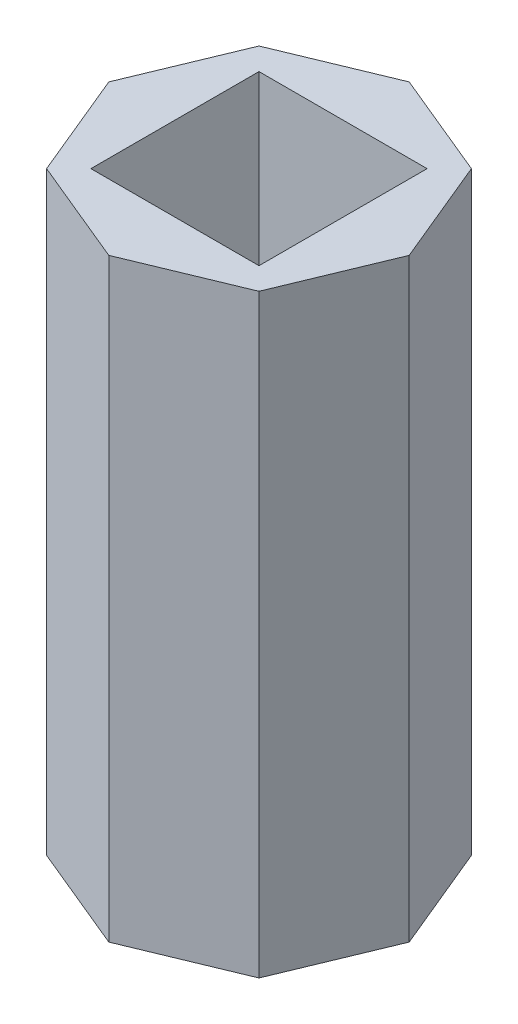
ISO-10303-21;
HEADER;
FILE_DESCRIPTION(('STEP AP214'),'2;1');
FILE_NAME('part.step','',(''),(''),'','','');
FILE_SCHEMA(('AUTOMOTIVE_DESIGN { 1 0 10303 214 1 1 1 1 }'));
ENDSEC;
DATA;
#1=APPLICATION_CONTEXT('core data for automotive mechanical design processes');
#2=APPLICATION_PROTOCOL_DEFINITION('international standard','automotive_design',2000,#1);
#3=PRODUCT_CONTEXT('',#1,'mechanical');
#4=PRODUCT('Part','Part','',(#3));
#5=PRODUCT_RELATED_PRODUCT_CATEGORY('part','',(#4));
#6=PRODUCT_DEFINITION_FORMATION('','',#4);
#7=PRODUCT_DEFINITION_CONTEXT('part definition',#1,'design');
#8=PRODUCT_DEFINITION('design','',#6,#7);
#9=PRODUCT_DEFINITION_SHAPE('','',#8);
#10=(LENGTH_UNIT() NAMED_UNIT(*) SI_UNIT(.MILLI.,.METRE.));
#11=(NAMED_UNIT(*) PLANE_ANGLE_UNIT() SI_UNIT($,.RADIAN.));
#12=(NAMED_UNIT(*) SI_UNIT($,.STERADIAN.) SOLID_ANGLE_UNIT());
#13=UNCERTAINTY_MEASURE_WITH_UNIT(LENGTH_MEASURE(1.E-05),#10,'distance_accuracy_value','');
#14=(GEOMETRIC_REPRESENTATION_CONTEXT(3) GLOBAL_UNCERTAINTY_ASSIGNED_CONTEXT((#13)) GLOBAL_UNIT_ASSIGNED_CONTEXT((#10,
#11,#12)) REPRESENTATION_CONTEXT('',''));
#15=CARTESIAN_POINT('',(0.,0.,0.));
#16=DIRECTION('',(0.,0.,1.));
#17=DIRECTION('',(1.,0.,0.));
#18=AXIS2_PLACEMENT_3D('',#15,#16,#17);
#19=CARTESIAN_POINT('',(0.,11.90625,0.));
#20=DIRECTION('',(0.,1.,0.));
#21=DIRECTION('',(0.,0.,1.));
#22=AXIS2_PLACEMENT_3D('',#19,#20,#21);
#23=PLANE('',#22);
#24=DIRECTION('',(-0.92387953251129,0.,-0.382683432365082));
#25=VECTOR('',#24,1.);
#26=CARTESIAN_POINT('',(4.25256964215703,11.90625,-4.2525696421571));
#27=LINE('',#26,#25);
#28=CARTESIAN_POINT('',(4.25256964215703,11.90625,-4.2525696421571));
#29=VERTEX_POINT('',#28);
#30=CARTESIAN_POINT('',(0.,11.90625,-6.01404166287462));
#31=VERTEX_POINT('',#30);
#32=EDGE_CURVE('E164',#29,#31,#27,.T.);
#33=ORIENTED_EDGE('',*,*,#32,.T.);
#34=DIRECTION('',(-0.923879532511283,0.,0.382683432365098));
#35=VECTOR('',#34,1.);
#36=CARTESIAN_POINT('',(0.,11.90625,-6.01404166287462));
#37=LINE('',#36,#35);
#38=CARTESIAN_POINT('',(-4.2525696421571,11.90625,-4.25256964215702));
#39=VERTEX_POINT('',#38);
#40=EDGE_CURVE('E167',#31,#39,#37,.T.);
#41=ORIENTED_EDGE('',*,*,#40,.T.);
#42=DIRECTION('',(-0.382683432365082,0.,0.92387953251129));
#43=VECTOR('',#42,1.);
#44=CARTESIAN_POINT('',(-4.2525696421571,11.90625,-4.25256964215702));
#45=LINE('',#44,#43);
#46=CARTESIAN_POINT('',(-6.01404166287461,11.90625,0.));
#47=VERTEX_POINT('',#46);
#48=EDGE_CURVE('E170',#39,#47,#45,.T.);
#49=ORIENTED_EDGE('',*,*,#48,.T.);
#50=DIRECTION('',(0.382683432365098,0.,0.923879532511283));
#51=VECTOR('',#50,1.);
#52=CARTESIAN_POINT('',(-6.01404166287461,11.90625,0.));
#53=LINE('',#52,#51);
#54=CARTESIAN_POINT('',(-4.25256964215702,11.90625,4.2525696421571));
#55=VERTEX_POINT('',#54);
#56=EDGE_CURVE('E172',#47,#55,#53,.T.);
#57=ORIENTED_EDGE('',*,*,#56,.T.);
#58=DIRECTION('',(0.92387953251129,0.,0.382683432365082));
#59=VECTOR('',#58,1.);
#60=CARTESIAN_POINT('',(-4.25256964215702,11.90625,4.2525696421571));
#61=LINE('',#60,#59);
#62=CARTESIAN_POINT('',(0.,11.90625,6.01404166287461));
#63=VERTEX_POINT('',#62);
#64=EDGE_CURVE('E174',#55,#63,#61,.T.);
#65=ORIENTED_EDGE('',*,*,#64,.T.);
#66=DIRECTION('',(0.923879532511284,0.,-0.382683432365097));
#67=VECTOR('',#66,1.);
#68=CARTESIAN_POINT('',(0.,11.90625,6.01404166287461));
#69=LINE('',#68,#67);
#70=CARTESIAN_POINT('',(4.2525696421571,11.90625,4.25256964215703));
#71=VERTEX_POINT('',#70);
#72=EDGE_CURVE('E176',#63,#71,#69,.T.);
#73=ORIENTED_EDGE('',*,*,#72,.T.);
#74=DIRECTION('',(0.382683432365082,0.,-0.92387953251129));
#75=VECTOR('',#74,1.);
#76=CARTESIAN_POINT('',(4.2525696421571,11.90625,4.25256964215703));
#77=LINE('',#76,#75);
#78=CARTESIAN_POINT('',(6.01404166287462,11.90625,0.));
#79=VERTEX_POINT('',#78);
#80=EDGE_CURVE('E178',#71,#79,#77,.T.);
#81=ORIENTED_EDGE('',*,*,#80,.T.);
#82=DIRECTION('',(-0.382683432365098,0.,-0.923879532511283));
#83=VECTOR('',#82,1.);
#84=CARTESIAN_POINT('',(6.01404166287462,11.90625,0.));
#85=LINE('',#84,#83);
#86=EDGE_CURVE('E180',#79,#29,#85,.T.);
#87=ORIENTED_EDGE('',*,*,#86,.T.);
#88=EDGE_LOOP('',(#33,#41,#49,#57,#65,#73,#81,#87));
#89=FACE_BOUND('',#88,.T.);
#90=DIRECTION('',(-1.,0.,0.));
#91=VECTOR('',#90,1.);
#92=CARTESIAN_POINT('',(-3.3655,11.90625,-3.3655));
#93=LINE('',#92,#91);
#94=CARTESIAN_POINT('',(3.3655,11.90625,-3.3655));
#95=VERTEX_POINT('',#94);
#96=CARTESIAN_POINT('',(-3.3655,11.90625,-3.3655));
#97=VERTEX_POINT('',#96);
#98=EDGE_CURVE('E136',#95,#97,#93,.T.);
#99=ORIENTED_EDGE('',*,*,#98,.F.);
#100=DIRECTION('',(0.,0.,-1.));
#101=VECTOR('',#100,1.);
#102=CARTESIAN_POINT('',(3.3655,11.90625,3.3655));
#103=LINE('',#102,#101);
#104=CARTESIAN_POINT('',(3.3655,11.90625,3.3655));
#105=VERTEX_POINT('',#104);
#106=EDGE_CURVE('E128',#105,#95,#103,.T.);
#107=ORIENTED_EDGE('',*,*,#106,.F.);
#108=DIRECTION('',(1.,0.,0.));
#109=VECTOR('',#108,1.);
#110=CARTESIAN_POINT('',(-3.3655,11.90625,3.3655));
#111=LINE('',#110,#109);
#112=CARTESIAN_POINT('',(-3.3655,11.90625,3.3655));
#113=VERTEX_POINT('',#112);
#114=EDGE_CURVE('E150',#113,#105,#111,.T.);
#115=ORIENTED_EDGE('',*,*,#114,.F.);
#116=DIRECTION('',(0.,0.,1.));
#117=VECTOR('',#116,1.);
#118=CARTESIAN_POINT('',(-3.3655,11.90625,3.3655));
#119=LINE('',#118,#117);
#120=EDGE_CURVE('E148',#97,#113,#119,.T.);
#121=ORIENTED_EDGE('',*,*,#120,.F.);
#122=EDGE_LOOP('',(#99,#107,#115,#121));
#123=FACE_BOUND('',#122,.T.);
#124=ADVANCED_FACE('F39',(#89,#123),#23,.T.);
#125=CARTESIAN_POINT('',(0.,-11.90625,0.));
#126=DIRECTION('',(0.,1.,0.));
#127=DIRECTION('',(0.,0.,1.));
#128=AXIS2_PLACEMENT_3D('',#125,#126,#127);
#129=PLANE('',#128);
#130=DIRECTION('',(-0.92387953251129,0.,-0.382683432365082));
#131=VECTOR('',#130,1.);
#132=CARTESIAN_POINT('',(4.25256964215703,-11.90625,-4.2525696421571));
#133=LINE('',#132,#131);
#134=CARTESIAN_POINT('',(4.25256964215703,-11.90625,-4.2525696421571));
#135=VERTEX_POINT('',#134);
#136=CARTESIAN_POINT('',(0.,-11.90625,-6.01404166287462));
#137=VERTEX_POINT('',#136);
#138=EDGE_CURVE('E144',#135,#137,#133,.T.);
#139=ORIENTED_EDGE('',*,*,#138,.F.);
#140=DIRECTION('',(-0.382683432365098,0.,-0.923879532511283));
#141=VECTOR('',#140,1.);
#142=CARTESIAN_POINT('',(6.01404166287462,-11.90625,0.));
#143=LINE('',#142,#141);
#144=CARTESIAN_POINT('',(6.01404166287462,-11.90625,0.));
#145=VERTEX_POINT('',#144);
#146=EDGE_CURVE('E168',#145,#135,#143,.T.);
#147=ORIENTED_EDGE('',*,*,#146,.F.);
#148=DIRECTION('',(0.382683432365082,0.,-0.92387953251129));
#149=VECTOR('',#148,1.);
#150=CARTESIAN_POINT('',(4.2525696421571,-11.90625,4.25256964215703));
#151=LINE('',#150,#149);
#152=CARTESIAN_POINT('',(4.2525696421571,-11.90625,4.25256964215703));
#153=VERTEX_POINT('',#152);
#154=EDGE_CURVE('E195',#153,#145,#151,.T.);
#155=ORIENTED_EDGE('',*,*,#154,.F.);
#156=DIRECTION('',(0.923879532511284,0.,-0.382683432365097));
#157=VECTOR('',#156,1.);
#158=CARTESIAN_POINT('',(0.,-11.90625,6.01404166287461));
#159=LINE('',#158,#157);
#160=CARTESIAN_POINT('',(0.,-11.90625,6.01404166287461));
#161=VERTEX_POINT('',#160);
#162=EDGE_CURVE('E193',#161,#153,#159,.T.);
#163=ORIENTED_EDGE('',*,*,#162,.F.);
#164=DIRECTION('',(0.92387953251129,0.,0.382683432365082));
#165=VECTOR('',#164,1.);
#166=CARTESIAN_POINT('',(-4.25256964215702,-11.90625,4.2525696421571));
#167=LINE('',#166,#165);
#168=CARTESIAN_POINT('',(-4.25256964215702,-11.90625,4.2525696421571));
#169=VERTEX_POINT('',#168);
#170=EDGE_CURVE('E191',#169,#161,#167,.T.);
#171=ORIENTED_EDGE('',*,*,#170,.F.);
#172=DIRECTION('',(0.382683432365098,0.,0.923879532511283));
#173=VECTOR('',#172,1.);
#174=CARTESIAN_POINT('',(-6.01404166287461,-11.90625,0.));
#175=LINE('',#174,#173);
#176=CARTESIAN_POINT('',(-6.01404166287461,-11.90625,0.));
#177=VERTEX_POINT('',#176);
#178=EDGE_CURVE('E189',#177,#169,#175,.T.);
#179=ORIENTED_EDGE('',*,*,#178,.F.);
#180=DIRECTION('',(-0.382683432365082,0.,0.92387953251129));
#181=VECTOR('',#180,1.);
#182=CARTESIAN_POINT('',(-4.2525696421571,-11.90625,-4.25256964215702));
#183=LINE('',#182,#181);
#184=CARTESIAN_POINT('',(-4.2525696421571,-11.90625,-4.25256964215702));
#185=VERTEX_POINT('',#184);
#186=EDGE_CURVE('E187',#185,#177,#183,.T.);
#187=ORIENTED_EDGE('',*,*,#186,.F.);
#188=DIRECTION('',(-0.923879532511283,0.,0.382683432365098));
#189=VECTOR('',#188,1.);
#190=CARTESIAN_POINT('',(0.,-11.90625,-6.01404166287462));
#191=LINE('',#190,#189);
#192=EDGE_CURVE('E185',#137,#185,#191,.T.);
#193=ORIENTED_EDGE('',*,*,#192,.F.);
#194=EDGE_LOOP('',(#139,#147,#155,#163,#171,#179,#187,#193));
#195=FACE_BOUND('',#194,.T.);
#196=DIRECTION('',(0.,0.,-1.));
#197=VECTOR('',#196,1.);
#198=CARTESIAN_POINT('',(3.3655,-11.90625,3.3655));
#199=LINE('',#198,#197);
#200=CARTESIAN_POINT('',(3.3655,-11.90625,3.3655));
#201=VERTEX_POINT('',#200);
#202=CARTESIAN_POINT('',(3.3655,-11.90625,-3.3655));
#203=VERTEX_POINT('',#202);
#204=EDGE_CURVE('E62',#201,#203,#199,.T.);
#205=ORIENTED_EDGE('',*,*,#204,.T.);
#206=DIRECTION('',(-1.,0.,0.));
#207=VECTOR('',#206,1.);
#208=CARTESIAN_POINT('',(-3.3655,-11.90625,-3.3655));
#209=LINE('',#208,#207);
#210=CARTESIAN_POINT('',(-3.3655,-11.90625,-3.3655));
#211=VERTEX_POINT('',#210);
#212=EDGE_CURVE('E143',#203,#211,#209,.T.);
#213=ORIENTED_EDGE('',*,*,#212,.T.);
#214=DIRECTION('',(0.,0.,1.));
#215=VECTOR('',#214,1.);
#216=CARTESIAN_POINT('',(-3.3655,-11.90625,3.3655));
#217=LINE('',#216,#215);
#218=CARTESIAN_POINT('',(-3.3655,-11.90625,3.3655));
#219=VERTEX_POINT('',#218);
#220=EDGE_CURVE('E156',#211,#219,#217,.T.);
#221=ORIENTED_EDGE('',*,*,#220,.T.);
#222=DIRECTION('',(1.,0.,0.));
#223=VECTOR('',#222,1.);
#224=CARTESIAN_POINT('',(-3.3655,-11.90625,3.3655));
#225=LINE('',#224,#223);
#226=EDGE_CURVE('E137',#219,#201,#225,.T.);
#227=ORIENTED_EDGE('',*,*,#226,.T.);
#228=EDGE_LOOP('',(#205,#213,#221,#227));
#229=FACE_BOUND('',#228,.T.);
#230=ADVANCED_FACE('F225',(#195,#229),#129,.F.);
#231=CARTESIAN_POINT('',(4.25256964215703,11.90625,-4.2525696421571));
#232=DIRECTION('',(-0.382683432365082,0.,0.92387953251129));
#233=DIRECTION('',(0.92387953251129,0.,0.382683432365082));
#234=AXIS2_PLACEMENT_3D('',#231,#232,#233);
#235=PLANE('',#234);
#236=ORIENTED_EDGE('',*,*,#138,.T.);
#237=DIRECTION('',(0.,-1.,0.));
#238=VECTOR('',#237,1.);
#239=CARTESIAN_POINT('',(0.,11.90625,-6.01404166287462));
#240=LINE('',#239,#238);
#241=EDGE_CURVE('E11',#31,#137,#240,.T.);
#242=ORIENTED_EDGE('',*,*,#241,.F.);
#243=ORIENTED_EDGE('',*,*,#32,.F.);
#244=DIRECTION('',(0.,-1.,0.));
#245=VECTOR('',#244,1.);
#246=CARTESIAN_POINT('',(4.25256964215703,11.90625,-4.2525696421571));
#247=LINE('',#246,#245);
#248=EDGE_CURVE('E182',#29,#135,#247,.T.);
#249=ORIENTED_EDGE('',*,*,#248,.T.);
#250=EDGE_LOOP('',(#236,#242,#243,#249));
#251=FACE_BOUND('',#250,.T.);
#252=ADVANCED_FACE('F41',(#251),#235,.F.);
#253=CARTESIAN_POINT('',(0.,11.90625,-6.01404166287462));
#254=DIRECTION('',(0.382683432365098,0.,0.923879532511283));
#255=DIRECTION('',(0.923879532511283,0.,-0.382683432365098));
#256=AXIS2_PLACEMENT_3D('',#253,#254,#255);
#257=PLANE('',#256);
#258=ORIENTED_EDGE('',*,*,#192,.T.);
#259=DIRECTION('',(0.,-1.,0.));
#260=VECTOR('',#259,1.);
#261=CARTESIAN_POINT('',(-4.2525696421571,11.90625,-4.25256964215702));
#262=LINE('',#261,#260);
#263=EDGE_CURVE('E47',#39,#185,#262,.T.);
#264=ORIENTED_EDGE('',*,*,#263,.F.);
#265=ORIENTED_EDGE('',*,*,#40,.F.);
#266=ORIENTED_EDGE('',*,*,#241,.T.);
#267=EDGE_LOOP('',(#258,#264,#265,#266));
#268=FACE_BOUND('',#267,.T.);
#269=ADVANCED_FACE('F242',(#268),#257,.F.);
#270=CARTESIAN_POINT('',(-4.2525696421571,11.90625,-4.25256964215702));
#271=DIRECTION('',(0.92387953251129,0.,0.382683432365082));
#272=DIRECTION('',(0.382683432365082,0.,-0.92387953251129));
#273=AXIS2_PLACEMENT_3D('',#270,#271,#272);
#274=PLANE('',#273);
#275=ORIENTED_EDGE('',*,*,#186,.T.);
#276=DIRECTION('',(0.,-1.,0.));
#277=VECTOR('',#276,1.);
#278=CARTESIAN_POINT('',(-6.01404166287461,11.90625,0.));
#279=LINE('',#278,#277);
#280=EDGE_CURVE('E212',#47,#177,#279,.T.);
#281=ORIENTED_EDGE('',*,*,#280,.F.);
#282=ORIENTED_EDGE('',*,*,#48,.F.);
#283=ORIENTED_EDGE('',*,*,#263,.T.);
#284=EDGE_LOOP('',(#275,#281,#282,#283));
#285=FACE_BOUND('',#284,.T.);
#286=ADVANCED_FACE('F219',(#285),#274,.F.);
#287=CARTESIAN_POINT('',(-6.01404166287461,11.90625,0.));
#288=DIRECTION('',(0.923879532511283,0.,-0.382683432365098));
#289=DIRECTION('',(-0.382683432365098,0.,-0.923879532511283));
#290=AXIS2_PLACEMENT_3D('',#287,#288,#289);
#291=PLANE('',#290);
#292=ORIENTED_EDGE('',*,*,#178,.T.);
#293=DIRECTION('',(0.,-1.,0.));
#294=VECTOR('',#293,1.);
#295=CARTESIAN_POINT('',(-4.25256964215702,11.90625,4.2525696421571));
#296=LINE('',#295,#294);
#297=EDGE_CURVE('E209',#55,#169,#296,.T.);
#298=ORIENTED_EDGE('',*,*,#297,.F.);
#299=ORIENTED_EDGE('',*,*,#56,.F.);
#300=ORIENTED_EDGE('',*,*,#280,.T.);
#301=EDGE_LOOP('',(#292,#298,#299,#300));
#302=FACE_BOUND('',#301,.T.);
#303=ADVANCED_FACE('F231',(#302),#291,.F.);
#304=CARTESIAN_POINT('',(-4.25256964215702,11.90625,4.2525696421571));
#305=DIRECTION('',(0.382683432365082,0.,-0.92387953251129));
#306=DIRECTION('',(-0.92387953251129,0.,-0.382683432365082));
#307=AXIS2_PLACEMENT_3D('',#304,#305,#306);
#308=PLANE('',#307);
#309=ORIENTED_EDGE('',*,*,#170,.T.);
#310=DIRECTION('',(0.,-1.,0.));
#311=VECTOR('',#310,1.);
#312=CARTESIAN_POINT('',(0.,11.90625,6.01404166287461));
#313=LINE('',#312,#311);
#314=EDGE_CURVE('E206',#63,#161,#313,.T.);
#315=ORIENTED_EDGE('',*,*,#314,.F.);
#316=ORIENTED_EDGE('',*,*,#64,.F.);
#317=ORIENTED_EDGE('',*,*,#297,.T.);
#318=EDGE_LOOP('',(#309,#315,#316,#317));
#319=FACE_BOUND('',#318,.T.);
#320=ADVANCED_FACE('F235',(#319),#308,.F.);
#321=CARTESIAN_POINT('',(0.,11.90625,6.01404166287461));
#322=DIRECTION('',(-0.382683432365097,0.,-0.923879532511284));
#323=DIRECTION('',(-0.923879532511284,0.,0.382683432365097));
#324=AXIS2_PLACEMENT_3D('',#321,#322,#323);
#325=PLANE('',#324);
#326=ORIENTED_EDGE('',*,*,#162,.T.);
#327=DIRECTION('',(0.,-1.,0.));
#328=VECTOR('',#327,1.);
#329=CARTESIAN_POINT('',(4.2525696421571,11.90625,4.25256964215703));
#330=LINE('',#329,#328);
#331=EDGE_CURVE('E203',#71,#153,#330,.T.);
#332=ORIENTED_EDGE('',*,*,#331,.F.);
#333=ORIENTED_EDGE('',*,*,#72,.F.);
#334=ORIENTED_EDGE('',*,*,#314,.T.);
#335=EDGE_LOOP('',(#326,#332,#333,#334));
#336=FACE_BOUND('',#335,.T.);
#337=ADVANCED_FACE('F255',(#336),#325,.F.);
#338=CARTESIAN_POINT('',(4.2525696421571,11.90625,4.25256964215703));
#339=DIRECTION('',(-0.92387953251129,0.,-0.382683432365082));
#340=DIRECTION('',(-0.382683432365082,0.,0.92387953251129));
#341=AXIS2_PLACEMENT_3D('',#338,#339,#340);
#342=PLANE('',#341);
#343=ORIENTED_EDGE('',*,*,#154,.T.);
#344=DIRECTION('',(0.,-1.,0.));
#345=VECTOR('',#344,1.);
#346=CARTESIAN_POINT('',(6.01404166287462,11.90625,0.));
#347=LINE('',#346,#345);
#348=EDGE_CURVE('E200',#79,#145,#347,.T.);
#349=ORIENTED_EDGE('',*,*,#348,.F.);
#350=ORIENTED_EDGE('',*,*,#80,.F.);
#351=ORIENTED_EDGE('',*,*,#331,.T.);
#352=EDGE_LOOP('',(#343,#349,#350,#351));
#353=FACE_BOUND('',#352,.T.);
#354=ADVANCED_FACE('F253',(#353),#342,.F.);
#355=CARTESIAN_POINT('',(6.01404166287462,11.90625,0.));
#356=DIRECTION('',(-0.923879532511283,0.,0.382683432365098));
#357=DIRECTION('',(0.382683432365098,0.,0.923879532511283));
#358=AXIS2_PLACEMENT_3D('',#355,#356,#357);
#359=PLANE('',#358);
#360=ORIENTED_EDGE('',*,*,#146,.T.);
#361=ORIENTED_EDGE('',*,*,#248,.F.);
#362=ORIENTED_EDGE('',*,*,#86,.F.);
#363=ORIENTED_EDGE('',*,*,#348,.T.);
#364=EDGE_LOOP('',(#360,#361,#362,#363));
#365=FACE_BOUND('',#364,.T.);
#366=ADVANCED_FACE('F248',(#365),#359,.F.);
#367=CARTESIAN_POINT('',(3.3655,11.90625,3.3655));
#368=DIRECTION('',(-1.,0.,0.));
#369=DIRECTION('',(0.,0.,1.));
#370=AXIS2_PLACEMENT_3D('',#367,#368,#369);
#371=PLANE('',#370);
#372=ORIENTED_EDGE('',*,*,#204,.F.);
#373=DIRECTION('',(0.,-1.,0.));
#374=VECTOR('',#373,1.);
#375=CARTESIAN_POINT('',(3.3655,11.90625,3.3655));
#376=LINE('',#375,#374);
#377=EDGE_CURVE('E132',#105,#201,#376,.T.);
#378=ORIENTED_EDGE('',*,*,#377,.F.);
#379=ORIENTED_EDGE('',*,*,#106,.T.);
#380=DIRECTION('',(0.,-1.,0.));
#381=VECTOR('',#380,1.);
#382=CARTESIAN_POINT('',(3.3655,11.90625,-3.3655));
#383=LINE('',#382,#381);
#384=EDGE_CURVE('E131',#95,#203,#383,.T.);
#385=ORIENTED_EDGE('',*,*,#384,.T.);
#386=EDGE_LOOP('',(#372,#378,#379,#385));
#387=FACE_BOUND('',#386,.T.);
#388=ADVANCED_FACE('F130',(#387),#371,.T.);
#389=CARTESIAN_POINT('',(-3.3655,11.90625,-3.3655));
#390=DIRECTION('',(0.,0.,1.));
#391=DIRECTION('',(1.,0.,0.));
#392=AXIS2_PLACEMENT_3D('',#389,#390,#391);
#393=PLANE('',#392);
#394=ORIENTED_EDGE('',*,*,#212,.F.);
#395=ORIENTED_EDGE('',*,*,#384,.F.);
#396=ORIENTED_EDGE('',*,*,#98,.T.);
#397=DIRECTION('',(0.,-1.,0.));
#398=VECTOR('',#397,1.);
#399=CARTESIAN_POINT('',(-3.3655,11.90625,-3.3655));
#400=LINE('',#399,#398);
#401=EDGE_CURVE('E145',#97,#211,#400,.T.);
#402=ORIENTED_EDGE('',*,*,#401,.T.);
#403=EDGE_LOOP('',(#394,#395,#396,#402));
#404=FACE_BOUND('',#403,.T.);
#405=ADVANCED_FACE('F140',(#404),#393,.T.);
#406=CARTESIAN_POINT('',(-3.3655,11.90625,3.3655));
#407=DIRECTION('',(1.,0.,0.));
#408=DIRECTION('',(0.,0.,-1.));
#409=AXIS2_PLACEMENT_3D('',#406,#407,#408);
#410=PLANE('',#409);
#411=ORIENTED_EDGE('',*,*,#220,.F.);
#412=ORIENTED_EDGE('',*,*,#401,.F.);
#413=ORIENTED_EDGE('',*,*,#120,.T.);
#414=DIRECTION('',(0.,-1.,0.));
#415=VECTOR('',#414,1.);
#416=CARTESIAN_POINT('',(-3.3655,11.90625,3.3655));
#417=LINE('',#416,#415);
#418=EDGE_CURVE('E54',#113,#219,#417,.T.);
#419=ORIENTED_EDGE('',*,*,#418,.T.);
#420=EDGE_LOOP('',(#411,#412,#413,#419));
#421=FACE_BOUND('',#420,.T.);
#422=ADVANCED_FACE('F280',(#421),#410,.T.);
#423=CARTESIAN_POINT('',(-3.3655,11.90625,3.3655));
#424=DIRECTION('',(0.,0.,-1.));
#425=DIRECTION('',(-1.,0.,0.));
#426=AXIS2_PLACEMENT_3D('',#423,#424,#425);
#427=PLANE('',#426);
#428=ORIENTED_EDGE('',*,*,#226,.F.);
#429=ORIENTED_EDGE('',*,*,#418,.F.);
#430=ORIENTED_EDGE('',*,*,#114,.T.);
#431=ORIENTED_EDGE('',*,*,#377,.T.);
#432=EDGE_LOOP('',(#428,#429,#430,#431));
#433=FACE_BOUND('',#432,.T.);
#434=ADVANCED_FACE('F284',(#433),#427,.T.);
#435=CLOSED_SHELL('',(#124,#230,#252,#269,#286,#303,#320,#337,#354,#366,#388,#405,#422,#434));
#436=MANIFOLD_SOLID_BREP('B2',#435);
#437=ADVANCED_BREP_SHAPE_REPRESENTATION('',(#18,#436),#14);
#438=SHAPE_DEFINITION_REPRESENTATION(#9,#437);
ENDSEC;
END-ISO-10303-21;
